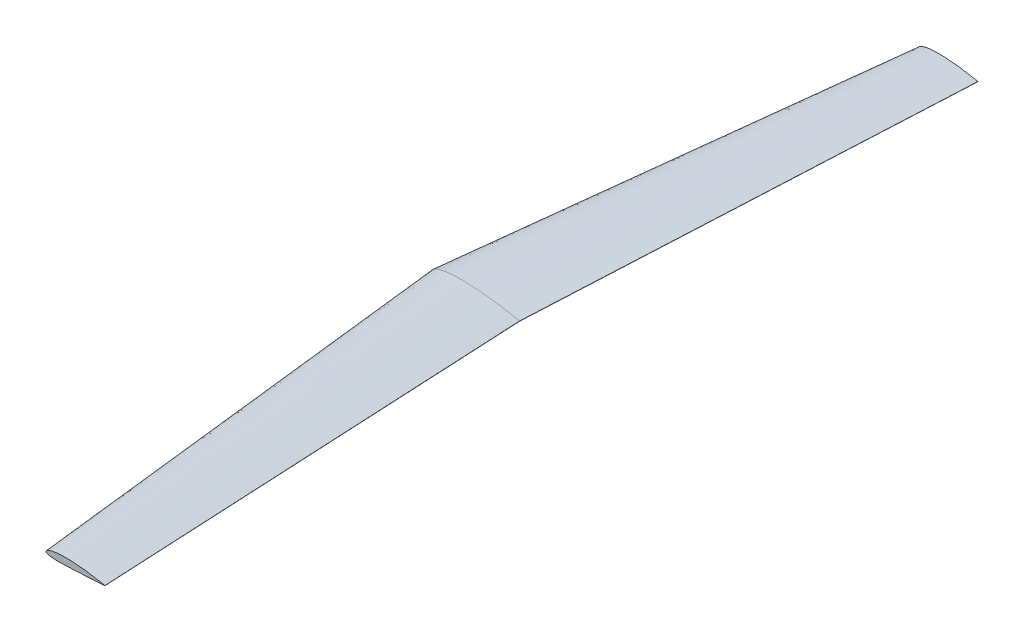
ISO-10303-21;
HEADER;
FILE_DESCRIPTION(('STEP AP214'),'2;1');
FILE_NAME('part.step','',(''),(''),'','','');
FILE_SCHEMA(('AUTOMOTIVE_DESIGN { 1 0 10303 214 1 1 1 1 }'));
ENDSEC;
DATA;
#1=APPLICATION_CONTEXT('core data for automotive mechanical design processes');
#2=APPLICATION_PROTOCOL_DEFINITION('international standard','automotive_design',2000,#1);
#3=PRODUCT_CONTEXT('',#1,'mechanical');
#4=PRODUCT('Part','Part','',(#3));
#5=PRODUCT_RELATED_PRODUCT_CATEGORY('part','',(#4));
#6=PRODUCT_DEFINITION_FORMATION('','',#4);
#7=PRODUCT_DEFINITION_CONTEXT('part definition',#1,'design');
#8=PRODUCT_DEFINITION('design','',#6,#7);
#9=PRODUCT_DEFINITION_SHAPE('','',#8);
#10=(LENGTH_UNIT() NAMED_UNIT(*) SI_UNIT(.MILLI.,.METRE.));
#11=(NAMED_UNIT(*) PLANE_ANGLE_UNIT() SI_UNIT($,.RADIAN.));
#12=(NAMED_UNIT(*) SI_UNIT($,.STERADIAN.) SOLID_ANGLE_UNIT());
#13=UNCERTAINTY_MEASURE_WITH_UNIT(LENGTH_MEASURE(1.E-05),#10,'distance_accuracy_value','');
#14=(GEOMETRIC_REPRESENTATION_CONTEXT(3) GLOBAL_UNCERTAINTY_ASSIGNED_CONTEXT((#13)) GLOBAL_UNIT_ASSIGNED_CONTEXT((#10,
#11,#12)) REPRESENTATION_CONTEXT('',''));
#15=CARTESIAN_POINT('',(0.,0.,0.));
#16=DIRECTION('',(0.,0.,1.));
#17=DIRECTION('',(1.,0.,0.));
#18=AXIS2_PLACEMENT_3D('',#15,#16,#17);
#19=CARTESIAN_POINT('',(79.0099016254819,-2.47787252947676,0.0931773209789763));
#20=CARTESIAN_POINT('',(129.010070625268,-2.38642462513718,1000.09317732098));
#21=CARTESIAN_POINT('',(65.734192943048,0.242501653442219,0.0931773209789763));
#22=CARTESIAN_POINT('',(120.037530200415,-0.547828440870057,1000.09317732098));
#23=CARTESIAN_POINT('',(39.1569959243988,5.0359607138702,0.0931773209789763));
#24=CARTESIAN_POINT('',(102.075025875155,2.69188600476831,1000.09317732098));
#25=CARTESIAN_POINT('',(5.75120574677112,9.49913466476749,0.0931773209789763));
#26=CARTESIAN_POINT('',(79.4973383133971,5.70837345982699,1000.09317732098));
#27=CARTESIAN_POINT('',(-34.2667902575063,12.9968914411844,0.0931773209789763));
#28=CARTESIAN_POINT('',(52.4507153828204,8.07237261222103,1000.09317732098));
#29=CARTESIAN_POINT('',(-69.6043832935036,14.1398970789593,0.0931773209789763));
#30=CARTESIAN_POINT('',(28.5673966375081,8.8448861206215,1000.09317732098));
#31=CARTESIAN_POINT('',(-99.6208712083152,9.27774430637366,0.0931773209789763));
#32=CARTESIAN_POINT('',(8.28040799756332,5.55874423943064,1000.09317732098));
#33=CARTESIAN_POINT('',(-111.077753100532,5.59043816876004,0.0931773209789763));
#34=CARTESIAN_POINT('',(0.537142581028948,3.06663597086629,1000.09317732098));
#35=CARTESIAN_POINT('',(-115.350287493693,3.69940279841295,0.0931773209789763));
#36=CARTESIAN_POINT('',(-2.35049893598748,1.78855796304463,1000.09317732098));
#37=CARTESIAN_POINT('',(-119.035737034601,1.40673159323435,0.0931773209789763));
#38=CARTESIAN_POINT('',(-4.84135240231157,0.239029756194175,1000.09317732098));
#39=CARTESIAN_POINT('',(-122.249574102872,-2.55811822591776,0.0931773209789763));
#40=CARTESIAN_POINT('',(-7.01346115399818,-2.44065960215128,1000.09317732098));
#41=CARTESIAN_POINT('',(-118.911253678474,-6.04314964905185,0.0931773209789763));
#42=CARTESIAN_POINT('',(-4.75721889412895,-4.79605817814805,1000.09317732098));
#43=CARTESIAN_POINT('',(-115.294739670237,-7.63264168412873,0.0931773209789763));
#44=CARTESIAN_POINT('',(-2.31295630053285,-5.87033465414358,1000.09317732098));
#45=CARTESIAN_POINT('',(-109.404730666697,-9.30447145851569,0.0931773209789763));
#46=CARTESIAN_POINT('',(1.66787403788372,-7.00026003839128,1000.09317732098));
#47=CARTESIAN_POINT('',(-91.0981971658513,-11.5641885951796,0.0931773209789763));
#48=CARTESIAN_POINT('',(14.0405552863506,-8.52751585896206,1000.09317732098));
#49=CARTESIAN_POINT('',(-60.9848173736455,-11.155651215448,0.0931773209789763));
#50=CARTESIAN_POINT('',(34.3930294161892,-8.25140117142338,1000.09317732098));
#51=CARTESIAN_POINT('',(-27.6415528257543,-9.86254724178284,0.0931773209789763));
#52=CARTESIAN_POINT('',(56.9284583118514,-7.37744197611498,1000.09317732098));
#53=CARTESIAN_POINT('',(19.021335172725,-7.0667071819358,0.0931773209789763));
#54=CARTESIAN_POINT('',(88.4661079335791,-5.48784131083427,1000.09317732098));
#55=CARTESIAN_POINT('',(52.3518426119764,-4.87913406287327,0.0931773209789763));
#56=CARTESIAN_POINT('',(110.992914790621,-4.00934485443935,1000.09317732098));
#57=CARTESIAN_POINT('',(79.009901625482,-2.99787209007732,0.0931773209789763));
#58=CARTESIAN_POINT('',(129.010070625268,-2.73787230977703,1000.09317732098));
#59=B_SPLINE_SURFACE_WITH_KNOTS('',3,1,((#19,#20),(#21,#22),(#23,#24),(#25,#26),(#27,#28),(#29,
#30),(#31,#32),(#33,#34),(#35,#36),(#37,#38),(#39,#40),(#41,#42),(#43,#44),(#45,#46),(#47,#48),
(#49,#50),(#51,#52),(#53,#54),(#55,#56),(#57,#58)),.UNSPECIFIED.,.F.,.F.,.F.,(4,1,1,1,1,1,1,1,1,
1,1,1,1,1,1,1,1,4),(2,2),(0.,0.0996729249269685,0.198581096615965,0.247805170456832,
0.395091203654929,0.457489818915221,0.470406405435489,0.483879408669829,0.491264120322896,
0.503458853294664,0.513609129403887,0.520450990700287,0.533235387615153,0.558031884237173,
0.656174271859652,0.754320378530032,0.803437363555032,1.),(0.,1.),.UNSPECIFIED.);
#60=CARTESIAN_POINT('',(79.0099016254819,-2.47787252947676,0.0931773209789763));
#61=CARTESIAN_POINT('',(65.734192943048,0.242501653442219,0.0931773209789763));
#62=CARTESIAN_POINT('',(39.1569959243988,5.0359607138702,0.0931773209789763));
#63=CARTESIAN_POINT('',(5.75120574677112,9.49913466476749,0.0931773209789763));
#64=CARTESIAN_POINT('',(-34.2667902575063,12.9968914411844,0.0931773209789763));
#65=CARTESIAN_POINT('',(-69.6043832935036,14.1398970789593,0.0931773209789763));
#66=CARTESIAN_POINT('',(-99.6208712083152,9.27774430637366,0.0931773209789763));
#67=CARTESIAN_POINT('',(-111.077753100532,5.59043816876004,0.0931773209789763));
#68=CARTESIAN_POINT('',(-115.350287493693,3.69940279841295,0.0931773209789763));
#69=CARTESIAN_POINT('',(-119.035737034601,1.40673159323435,0.0931773209789763));
#70=CARTESIAN_POINT('',(-122.249574102872,-2.55811822591776,0.0931773209789763));
#71=CARTESIAN_POINT('',(-118.911253678474,-6.04314964905185,0.0931773209789763));
#72=CARTESIAN_POINT('',(-115.294739670237,-7.63264168412873,0.0931773209789763));
#73=CARTESIAN_POINT('',(-109.404730666697,-9.30447145851569,0.0931773209789763));
#74=CARTESIAN_POINT('',(-91.0981971658513,-11.5641885951796,0.0931773209789763));
#75=CARTESIAN_POINT('',(-60.9848173736455,-11.155651215448,0.0931773209789763));
#76=CARTESIAN_POINT('',(-27.6415528257543,-9.86254724178284,0.0931773209789763));
#77=CARTESIAN_POINT('',(19.021335172725,-7.0667071819358,0.0931773209789763));
#78=CARTESIAN_POINT('',(52.3518426119764,-4.87913406287327,0.0931773209789763));
#79=CARTESIAN_POINT('',(79.009901625482,-2.99787209007732,0.0931773209789763));
#80=B_SPLINE_CURVE_WITH_KNOTS('',3,(#60,#61,#62,#63,#64,#65,#66,#67,#68,#69,#70,#71,#72,#73,#74,
#75,#76,#77,#78,#79),.UNSPECIFIED.,.F.,.F.,(4,1,1,1,1,1,1,1,1,1,1,1,1,1,1,1,1,4),(0.,
0.0996729249269685,0.198581096615965,0.247805170456832,0.395091203654929,0.457489818915221,
0.470406405435489,0.483879408669829,0.491264120322896,0.503458853294664,0.513609129403887,
0.520450990700287,0.533235387615153,0.558031884237173,0.656174271859652,0.754320378530032,
0.803437363555032,1.),.UNSPECIFIED.);
#81=CARTESIAN_POINT('',(79.0099016254819,-2.47787252947676,0.0931773209789763));
#82=VERTEX_POINT('',#81);
#83=CARTESIAN_POINT('',(79.009901625482,-2.99787209007732,0.0931773209789763));
#84=VERTEX_POINT('',#83);
#85=EDGE_CURVE('E13',#82,#84,#80,.T.);
#86=DIRECTION('',(0.0499377836282164,0.000259675377738728,0.998752296785845));
#87=VECTOR('',#86,1.);
#88=CARTESIAN_POINT('',(104.009986125375,-2.86787219992717,500.093177320979));
#89=LINE('',#88,#87);
#90=CARTESIAN_POINT('',(129.010070625268,-2.73787230977703,1000.09317732098));
#91=VERTEX_POINT('',#90);
#92=EDGE_CURVE('E135',#84,#91,#89,.T.);
#93=CARTESIAN_POINT('',(129.010070625268,-2.38642462513718,1000.09317732098));
#94=CARTESIAN_POINT('',(120.037530200415,-0.547828440870057,1000.09317732098));
#95=CARTESIAN_POINT('',(102.075025875155,2.69188600476831,1000.09317732098));
#96=CARTESIAN_POINT('',(79.4973383133971,5.70837345982699,1000.09317732098));
#97=CARTESIAN_POINT('',(52.4507153828204,8.07237261222103,1000.09317732098));
#98=CARTESIAN_POINT('',(28.5673966375081,8.8448861206215,1000.09317732098));
#99=CARTESIAN_POINT('',(8.28040799756332,5.55874423943064,1000.09317732098));
#100=CARTESIAN_POINT('',(0.537142581028948,3.06663597086629,1000.09317732098));
#101=CARTESIAN_POINT('',(-2.35049893598748,1.78855796304463,1000.09317732098));
#102=CARTESIAN_POINT('',(-4.84135240231157,0.239029756194175,1000.09317732098));
#103=CARTESIAN_POINT('',(-7.01346115399818,-2.44065960215128,1000.09317732098));
#104=CARTESIAN_POINT('',(-4.75721889412895,-4.79605817814805,1000.09317732098));
#105=CARTESIAN_POINT('',(-2.31295630053285,-5.87033465414358,1000.09317732098));
#106=CARTESIAN_POINT('',(1.66787403788372,-7.00026003839128,1000.09317732098));
#107=CARTESIAN_POINT('',(14.0405552863506,-8.52751585896206,1000.09317732098));
#108=CARTESIAN_POINT('',(34.3930294161892,-8.25140117142338,1000.09317732098));
#109=CARTESIAN_POINT('',(56.9284583118514,-7.37744197611498,1000.09317732098));
#110=CARTESIAN_POINT('',(88.4661079335791,-5.48784131083427,1000.09317732098));
#111=CARTESIAN_POINT('',(110.992914790621,-4.00934485443935,1000.09317732098));
#112=CARTESIAN_POINT('',(129.010070625268,-2.73787230977703,1000.09317732098));
#113=B_SPLINE_CURVE_WITH_KNOTS('',3,(#93,#94,#95,#96,#97,#98,#99,#100,#101,#102,#103,#104,#105,
#106,#107,#108,#109,#110,#111,#112),.UNSPECIFIED.,.F.,.F.,(4,1,1,1,1,1,1,1,1,1,1,1,1,1,1,1,1,4),
(0.,0.0996729249269685,0.198581096615965,0.247805170456832,0.395091203654929,0.457489818915221,
0.470406405435489,0.483879408669829,0.491264120322896,0.503458853294664,0.513609129403887,
0.520450990700287,0.533235387615153,0.558031884237173,0.656174271859652,0.754320378530032,
0.803437363555032,1.),.UNSPECIFIED.);
#114=CARTESIAN_POINT('',(129.010070625268,-2.38642462513718,1000.09317732098));
#115=VERTEX_POINT('',#114);
#116=EDGE_CURVE('E182',#115,#91,#113,.T.);
#117=DIRECTION('',(0.0499377851036143,9.13338071938344E-05,0.998752326293702));
#118=VECTOR('',#117,1.);
#119=CARTESIAN_POINT('',(104.009986125375,-2.43214857730697,500.093177320979));
#120=LINE('',#119,#118);
#121=EDGE_CURVE('E179',#82,#115,#120,.T.);
#122=ORIENTED_EDGE('',*,*,#85,.T.);
#123=ORIENTED_EDGE('',*,*,#92,.T.);
#124=ORIENTED_EDGE('',*,*,#116,.F.);
#125=ORIENTED_EDGE('',*,*,#121,.F.);
#126=EDGE_LOOP('',(#122,#123,#124,#125));
#127=FACE_BOUND('',#126,.T.);
#128=ADVANCED_FACE('F124',(#127),#59,.T.);
#129=CARTESIAN_POINT('',(79.009901625482,-2.99787209007732,0.0931773209789763));
#130=DIRECTION('',(0.99875233045943,0.,-0.0499377853119014));
#131=DIRECTION('',(0.,1.,0.));
#132=AXIS2_PLACEMENT_3D('',#129,#130,#131);
#133=PLANE('',#132);
#134=DIRECTION('',(0.,1.,0.));
#135=VECTOR('',#134,1.);
#136=CARTESIAN_POINT('',(79.009901625482,-2.73787230977704,0.0931773209789763));
#137=LINE('',#136,#135);
#138=EDGE_CURVE('E168',#84,#82,#137,.T.);
#139=ORIENTED_EDGE('',*,*,#138,.T.);
#140=ORIENTED_EDGE('',*,*,#121,.T.);
#141=DIRECTION('',(0.,1.,0.));
#142=VECTOR('',#141,1.);
#143=CARTESIAN_POINT('',(129.010070625268,-2.56214846745711,1000.09317732098));
#144=LINE('',#143,#142);
#145=EDGE_CURVE('E128',#91,#115,#144,.T.);
#146=ORIENTED_EDGE('',*,*,#145,.F.);
#147=ORIENTED_EDGE('',*,*,#92,.F.);
#148=EDGE_LOOP('',(#139,#140,#146,#147));
#149=FACE_BOUND('',#148,.T.);
#150=ADVANCED_FACE('F126',(#149),#133,.T.);
#151=CARTESIAN_POINT('',(-6.03641681758285,-1.67405914860993,1000.09317732098));
#152=DIRECTION('',(0.,0.,-1.));
#153=DIRECTION('',(-1.,0.,0.));
#154=AXIS2_PLACEMENT_3D('',#151,#152,#153);
#155=PLANE('',#154);
#156=ORIENTED_EDGE('',*,*,#116,.T.);
#157=ORIENTED_EDGE('',*,*,#145,.T.);
#158=EDGE_LOOP('',(#156,#157));
#159=FACE_BOUND('',#158,.T.);
#160=ADVANCED_FACE('F222',(#159),#155,.F.);
#161=CARTESIAN_POINT('',(79.0099016254819,-2.47787252947676,0.0931773209789763));
#162=CARTESIAN_POINT('',(129.010070625268,-2.38642462513718,-999.906822679021));
#163=CARTESIAN_POINT('',(65.734192943048,0.242501653442219,0.0931773209789763));
#164=CARTESIAN_POINT('',(120.037530200415,-0.547828440870057,-999.906822679021));
#165=CARTESIAN_POINT('',(39.1569959243988,5.0359607138702,0.0931773209789763));
#166=CARTESIAN_POINT('',(102.075025875155,2.69188600476831,-999.906822679021));
#167=CARTESIAN_POINT('',(5.75120574677112,9.49913466476749,0.0931773209789763));
#168=CARTESIAN_POINT('',(79.4973383133971,5.70837345982699,-999.906822679021));
#169=CARTESIAN_POINT('',(-34.2667902575063,12.9968914411844,0.0931773209789763));
#170=CARTESIAN_POINT('',(52.4507153828204,8.07237261222103,-999.906822679021));
#171=CARTESIAN_POINT('',(-69.6043832935036,14.1398970789593,0.0931773209789763));
#172=CARTESIAN_POINT('',(28.5673966375081,8.8448861206215,-999.906822679021));
#173=CARTESIAN_POINT('',(-99.6208712083152,9.27774430637366,0.0931773209789763));
#174=CARTESIAN_POINT('',(8.28040799756332,5.55874423943064,-999.906822679021));
#175=CARTESIAN_POINT('',(-111.077753100532,5.59043816876004,0.0931773209789763));
#176=CARTESIAN_POINT('',(0.537142581028948,3.06663597086629,-999.906822679021));
#177=CARTESIAN_POINT('',(-115.350287493693,3.69940279841295,0.0931773209789763));
#178=CARTESIAN_POINT('',(-2.35049893598748,1.78855796304463,-999.906822679021));
#179=CARTESIAN_POINT('',(-119.035737034601,1.40673159323435,0.0931773209789763));
#180=CARTESIAN_POINT('',(-4.84135240231157,0.239029756194175,-999.906822679021));
#181=CARTESIAN_POINT('',(-122.249574102872,-2.55811822591776,0.0931773209789763));
#182=CARTESIAN_POINT('',(-7.01346115399818,-2.44065960215128,-999.906822679021));
#183=CARTESIAN_POINT('',(-118.911253678474,-6.04314964905185,0.0931773209789763));
#184=CARTESIAN_POINT('',(-4.75721889412895,-4.79605817814805,-999.906822679021));
#185=CARTESIAN_POINT('',(-115.294739670237,-7.63264168412873,0.0931773209789763));
#186=CARTESIAN_POINT('',(-2.31295630053285,-5.87033465414358,-999.906822679021));
#187=CARTESIAN_POINT('',(-109.404730666697,-9.30447145851569,0.0931773209789763));
#188=CARTESIAN_POINT('',(1.66787403788372,-7.00026003839128,-999.906822679021));
#189=CARTESIAN_POINT('',(-91.0981971658513,-11.5641885951796,0.0931773209789763));
#190=CARTESIAN_POINT('',(14.0405552863506,-8.52751585896206,-999.906822679021));
#191=CARTESIAN_POINT('',(-60.9848173736455,-11.155651215448,0.0931773209789763));
#192=CARTESIAN_POINT('',(34.3930294161892,-8.25140117142338,-999.906822679021));
#193=CARTESIAN_POINT('',(-27.6415528257543,-9.86254724178284,0.0931773209789763));
#194=CARTESIAN_POINT('',(56.9284583118514,-7.37744197611498,-999.906822679021));
#195=CARTESIAN_POINT('',(19.021335172725,-7.0667071819358,0.0931773209789763));
#196=CARTESIAN_POINT('',(88.4661079335791,-5.48784131083427,-999.906822679021));
#197=CARTESIAN_POINT('',(52.3518426119764,-4.87913406287327,0.0931773209789763));
#198=CARTESIAN_POINT('',(110.992914790621,-4.00934485443935,-999.906822679021));
#199=CARTESIAN_POINT('',(79.009901625482,-2.99787209007732,0.0931773209789763));
#200=CARTESIAN_POINT('',(129.010070625268,-2.73787230977703,-999.906822679021));
#201=B_SPLINE_SURFACE_WITH_KNOTS('',3,1,((#161,#162),(#163,#164),(#165,#166),(#167,#168),(#169,
#170),(#171,#172),(#173,#174),(#175,#176),(#177,#178),(#179,#180),(#181,#182),(#183,#184),(#185,
#186),(#187,#188),(#189,#190),(#191,#192),(#193,#194),(#195,#196),(#197,#198),(#199,#200)),
.UNSPECIFIED.,.F.,.F.,.F.,(4,1,1,1,1,1,1,1,1,1,1,1,1,1,1,1,1,4),(2,2),(0.,0.0996729249269685,
0.198581096615965,0.247805170456832,0.395091203654929,0.457489818915221,0.470406405435489,
0.483879408669829,0.491264120322896,0.503458853294664,0.513609129403887,0.520450990700287,
0.533235387615153,0.558031884237173,0.656174271859652,0.754320378530032,0.803437363555032,1.),
(0.,1.),.UNSPECIFIED.);
#202=DIRECTION('',(0.0499377851036143,9.13338071938344E-05,-0.998752326293702));
#203=VECTOR('',#202,1.);
#204=CARTESIAN_POINT('',(104.009986125375,-2.43214857730697,-499.906822679021));
#205=LINE('',#204,#203);
#206=CARTESIAN_POINT('',(129.010070625268,-2.38642462513718,-999.906822679021));
#207=VERTEX_POINT('',#206);
#208=EDGE_CURVE('E165',#82,#207,#205,.T.);
#209=CARTESIAN_POINT('',(129.010070625268,-2.38642462513718,-999.906822679021));
#210=CARTESIAN_POINT('',(120.037530200415,-0.547828440870057,-999.906822679021));
#211=CARTESIAN_POINT('',(102.075025875155,2.69188600476831,-999.906822679021));
#212=CARTESIAN_POINT('',(79.4973383133971,5.70837345982699,-999.906822679021));
#213=CARTESIAN_POINT('',(52.4507153828204,8.07237261222103,-999.906822679021));
#214=CARTESIAN_POINT('',(28.5673966375081,8.8448861206215,-999.906822679021));
#215=CARTESIAN_POINT('',(8.28040799756332,5.55874423943064,-999.906822679021));
#216=CARTESIAN_POINT('',(0.537142581028948,3.06663597086629,-999.906822679021));
#217=CARTESIAN_POINT('',(-2.35049893598748,1.78855796304463,-999.906822679021));
#218=CARTESIAN_POINT('',(-4.84135240231157,0.239029756194175,-999.906822679021));
#219=CARTESIAN_POINT('',(-7.01346115399818,-2.44065960215128,-999.906822679021));
#220=CARTESIAN_POINT('',(-4.75721889412895,-4.79605817814805,-999.906822679021));
#221=CARTESIAN_POINT('',(-2.31295630053285,-5.87033465414358,-999.906822679021));
#222=CARTESIAN_POINT('',(1.66787403788372,-7.00026003839128,-999.906822679021));
#223=CARTESIAN_POINT('',(14.0405552863506,-8.52751585896206,-999.906822679021));
#224=CARTESIAN_POINT('',(34.3930294161892,-8.25140117142338,-999.906822679021));
#225=CARTESIAN_POINT('',(56.9284583118514,-7.37744197611498,-999.906822679021));
#226=CARTESIAN_POINT('',(88.4661079335791,-5.48784131083427,-999.906822679021));
#227=CARTESIAN_POINT('',(110.992914790621,-4.00934485443935,-999.906822679021));
#228=CARTESIAN_POINT('',(129.010070625268,-2.73787230977703,-999.906822679021));
#229=B_SPLINE_CURVE_WITH_KNOTS('',3,(#209,#210,#211,#212,#213,#214,#215,#216,#217,#218,#219,
#220,#221,#222,#223,#224,#225,#226,#227,#228),.UNSPECIFIED.,.F.,.F.,(4,1,1,1,1,1,1,1,1,1,1,1,1,
1,1,1,1,4),(0.,0.0996729249269685,0.198581096615965,0.247805170456832,0.395091203654929,
0.457489818915221,0.470406405435489,0.483879408669829,0.491264120322896,0.503458853294664,
0.513609129403887,0.520450990700287,0.533235387615153,0.558031884237173,0.656174271859652,
0.754320378530032,0.803437363555032,1.),.UNSPECIFIED.);
#230=CARTESIAN_POINT('',(129.010070625268,-2.73787230977703,-999.906822679021));
#231=VERTEX_POINT('',#230);
#232=EDGE_CURVE('E170',#207,#231,#229,.T.);
#233=DIRECTION('',(0.0499377836282164,0.000259675377738728,-0.998752296785845));
#234=VECTOR('',#233,1.);
#235=CARTESIAN_POINT('',(104.009986125375,-2.86787219992717,-499.906822679021));
#236=LINE('',#235,#234);
#237=EDGE_CURVE('E143',#84,#231,#236,.T.);
#238=ORIENTED_EDGE('',*,*,#85,.F.);
#239=ORIENTED_EDGE('',*,*,#208,.T.);
#240=ORIENTED_EDGE('',*,*,#232,.T.);
#241=ORIENTED_EDGE('',*,*,#237,.F.);
#242=EDGE_LOOP('',(#238,#239,#240,#241));
#243=FACE_BOUND('',#242,.T.);
#244=ADVANCED_FACE('F172',(#243),#201,.F.);
#245=CARTESIAN_POINT('',(79.009901625482,-2.99787209007732,0.0931773209789763));
#246=DIRECTION('',(0.99875233045943,0.,0.0499377853119014));
#247=DIRECTION('',(0.,1.,0.));
#248=AXIS2_PLACEMENT_3D('',#245,#246,#247);
#249=PLANE('',#248);
#250=ORIENTED_EDGE('',*,*,#138,.F.);
#251=ORIENTED_EDGE('',*,*,#237,.T.);
#252=DIRECTION('',(0.,1.,0.));
#253=VECTOR('',#252,1.);
#254=CARTESIAN_POINT('',(129.010070625268,-2.56214846745711,-999.906822679021));
#255=LINE('',#254,#253);
#256=EDGE_CURVE('E159',#231,#207,#255,.T.);
#257=ORIENTED_EDGE('',*,*,#256,.T.);
#258=ORIENTED_EDGE('',*,*,#208,.F.);
#259=EDGE_LOOP('',(#250,#251,#257,#258));
#260=FACE_BOUND('',#259,.T.);
#261=ADVANCED_FACE('F166',(#260),#249,.T.);
#262=CARTESIAN_POINT('',(-6.03641681758285,-1.67405914860993,-999.906822679021));
#263=DIRECTION('',(0.,0.,1.));
#264=DIRECTION('',(-1.,0.,0.));
#265=AXIS2_PLACEMENT_3D('',#262,#263,#264);
#266=PLANE('',#265);
#267=ORIENTED_EDGE('',*,*,#232,.F.);
#268=ORIENTED_EDGE('',*,*,#256,.F.);
#269=EDGE_LOOP('',(#267,#268));
#270=FACE_BOUND('',#269,.T.);
#271=ADVANCED_FACE('F209',(#270),#266,.F.);
#272=CLOSED_SHELL('',(#128,#150,#160,#244,#261,#271));
#273=MANIFOLD_SOLID_BREP('B2',#272);
#274=ADVANCED_BREP_SHAPE_REPRESENTATION('',(#18,#273),#14);
#275=SHAPE_DEFINITION_REPRESENTATION(#9,#274);
ENDSEC;
END-ISO-10303-21;
